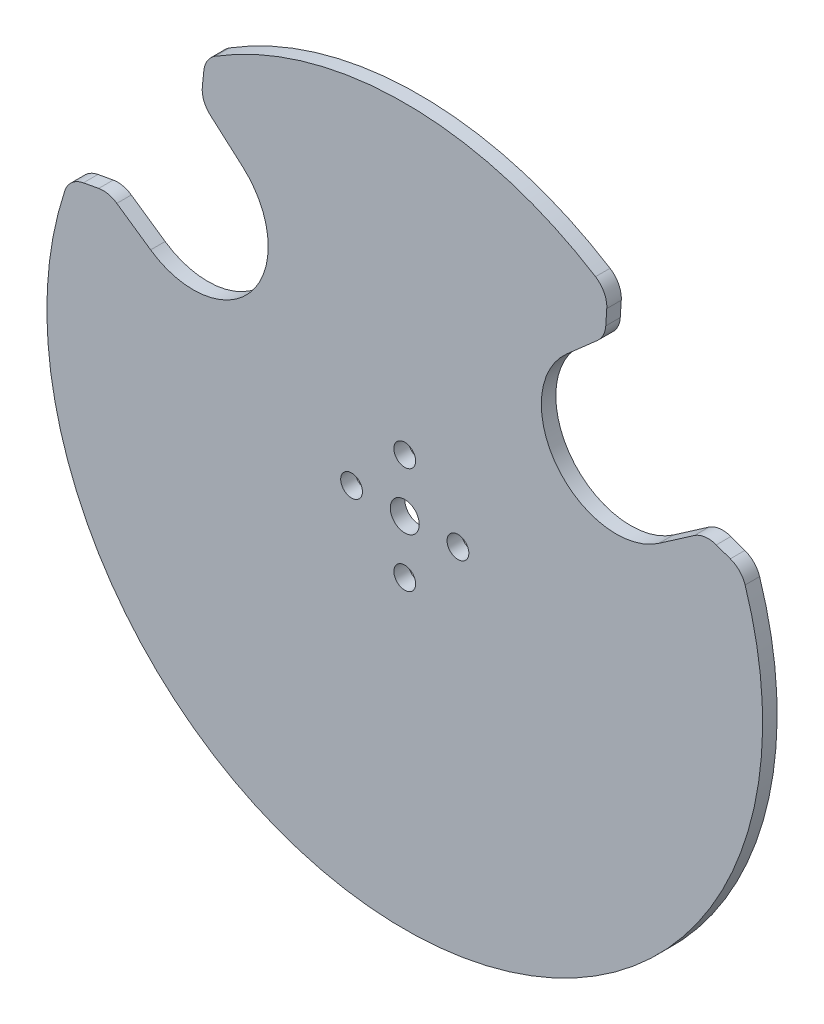
ISO-10303-21;
HEADER;
FILE_DESCRIPTION(('STEP AP214'),'2;1');
FILE_NAME('part.step','',(''),(''),'','','');
FILE_SCHEMA(('AUTOMOTIVE_DESIGN { 1 0 10303 214 1 1 1 1 }'));
ENDSEC;
DATA;
#1=APPLICATION_CONTEXT('core data for automotive mechanical design processes');
#2=APPLICATION_PROTOCOL_DEFINITION('international standard','automotive_design',2000,#1);
#3=PRODUCT_CONTEXT('',#1,'mechanical');
#4=PRODUCT('Part','Part','',(#3));
#5=PRODUCT_RELATED_PRODUCT_CATEGORY('part','',(#4));
#6=PRODUCT_DEFINITION_FORMATION('','',#4);
#7=PRODUCT_DEFINITION_CONTEXT('part definition',#1,'design');
#8=PRODUCT_DEFINITION('design','',#6,#7);
#9=PRODUCT_DEFINITION_SHAPE('','',#8);
#10=(LENGTH_UNIT() NAMED_UNIT(*) SI_UNIT(.MILLI.,.METRE.));
#11=(NAMED_UNIT(*) PLANE_ANGLE_UNIT() SI_UNIT($,.RADIAN.));
#12=(NAMED_UNIT(*) SI_UNIT($,.STERADIAN.) SOLID_ANGLE_UNIT());
#13=UNCERTAINTY_MEASURE_WITH_UNIT(LENGTH_MEASURE(1.E-05),#10,'distance_accuracy_value','');
#14=(GEOMETRIC_REPRESENTATION_CONTEXT(3) GLOBAL_UNCERTAINTY_ASSIGNED_CONTEXT((#13)) GLOBAL_UNIT_ASSIGNED_CONTEXT((#10,
#11,#12)) REPRESENTATION_CONTEXT('',''));
#15=CARTESIAN_POINT('',(0.,0.,0.));
#16=DIRECTION('',(0.,0.,1.));
#17=DIRECTION('',(1.,0.,0.));
#18=AXIS2_PLACEMENT_3D('',#15,#16,#17);
#19=CARTESIAN_POINT('',(0.,0.,3.));
#20=DIRECTION('',(0.,0.,1.));
#21=DIRECTION('',(1.,0.,0.));
#22=AXIS2_PLACEMENT_3D('',#19,#20,#21);
#23=PLANE('',#22);
#24=CARTESIAN_POINT('',(-11.,0.,3.));
#25=DIRECTION('',(0.,0.,1.));
#26=DIRECTION('',(1.,0.,0.));
#27=AXIS2_PLACEMENT_3D('',#24,#25,#26);
#28=CIRCLE('',#27,2.25);
#29=CARTESIAN_POINT('',(-8.75,0.,3.));
#30=VERTEX_POINT('',#29);
#31=EDGE_CURVE('E473',#30,#30,#28,.T.);
#32=ORIENTED_EDGE('',*,*,#31,.F.);
#33=EDGE_LOOP('',(#32));
#34=FACE_BOUND('',#33,.T.);
#35=CARTESIAN_POINT('',(11.,0.,3.));
#36=DIRECTION('',(0.,0.,1.));
#37=DIRECTION('',(1.,0.,0.));
#38=AXIS2_PLACEMENT_3D('',#35,#36,#37);
#39=CIRCLE('',#38,2.25);
#40=CARTESIAN_POINT('',(13.25,0.,3.));
#41=VERTEX_POINT('',#40);
#42=EDGE_CURVE('E457',#41,#41,#39,.T.);
#43=ORIENTED_EDGE('',*,*,#42,.F.);
#44=EDGE_LOOP('',(#43));
#45=FACE_BOUND('',#44,.T.);
#46=CARTESIAN_POINT('',(0.,0.,3.));
#47=DIRECTION('',(0.,0.,1.));
#48=DIRECTION('',(1.,0.,0.));
#49=AXIS2_PLACEMENT_3D('',#46,#47,#48);
#50=CIRCLE('',#49,74.);
#51=CARTESIAN_POINT('',(39.4431417206004,62.6118085604355,3.));
#52=VERTEX_POINT('',#51);
#53=CARTESIAN_POINT('',(-39.2208901456096,62.7512691201224,3.));
#54=VERTEX_POINT('',#53);
#55=EDGE_CURVE('E216',#52,#54,#50,.T.);
#56=ORIENTED_EDGE('',*,*,#55,.T.);
#57=CARTESIAN_POINT('',(-36.570830000636,58.5113185038979,3.));
#58=DIRECTION('',(0.,0.,1.));
#59=DIRECTION('',(1.,0.,0.));
#60=AXIS2_PLACEMENT_3D('',#57,#58,#59);
#61=CIRCLE('',#60,5.);
#62=CARTESIAN_POINT('',(-41.5444900097638,59.023867149007,3.));
#63=VERTEX_POINT('',#62);
#64=EDGE_CURVE('E326',#54,#63,#61,.T.);
#65=ORIENTED_EDGE('',*,*,#64,.T.);
#66=DIRECTION('',(0.102509729021823,0.994732001825553,0.));
#67=VECTOR('',#66,1.);
#68=CARTESIAN_POINT('',(-47.126576844926,4.85651674343806,3.));
#69=LINE('',#68,#67);
#70=CARTESIAN_POINT('',(-41.8599410967015,55.9627987588948,3.));
#71=VERTEX_POINT('',#70);
#72=EDGE_CURVE('E287',#63,#71,#69,.F.);
#73=ORIENTED_EDGE('',*,*,#72,.T.);
#74=CARTESIAN_POINT('',(-36.8862810875738,55.4502501137857,3.));
#75=DIRECTION('',(0.,0.,1.));
#76=DIRECTION('',(1.,0.,0.));
#77=AXIS2_PLACEMENT_3D('',#74,#75,#76);
#78=CIRCLE('',#77,5.);
#79=CARTESIAN_POINT('',(-40.1894843136318,51.6967386315386,3.));
#80=VERTEX_POINT('',#79);
#81=EDGE_CURVE('E323',#71,#80,#78,.T.);
#82=ORIENTED_EDGE('',*,*,#81,.T.);
#83=DIRECTION('',(0.750702296449405,-0.660640645211593,0.));
#84=VECTOR('',#83,1.);
#85=CARTESIAN_POINT('',(-46.6863350374643,57.4141630677451,3.));
#86=LINE('',#85,#84);
#87=CARTESIAN_POINT('',(-33.4946668243935,45.8050974755397,3.));
#88=VERTEX_POINT('',#87);
#89=EDGE_CURVE('E222',#80,#88,#86,.T.);
#90=ORIENTED_EDGE('',*,*,#89,.T.);
#91=CARTESIAN_POINT('',(-43.7345968251731,34.169211880574,3.));
#92=DIRECTION('',(0.,0.,-1.));
#93=DIRECTION('',(1.,0.,0.));
#94=AXIS2_PLACEMENT_3D('',#91,#92,#93);
#95=CIRCLE('',#94,15.5);
#96=CARTESIAN_POINT('',(-52.5475836128083,21.418476063337,3.));
#97=VERTEX_POINT('',#96);
#98=EDGE_CURVE('E225',#88,#97,#95,.T.);
#99=ORIENTED_EDGE('',*,*,#98,.T.);
#100=DIRECTION('',(-0.822628117241092,0.568579792750654,0.));
#101=VECTOR('',#100,1.);
#102=CARTESIAN_POINT('',(-67.003163723211,31.4098081987233,3.));
#103=LINE('',#102,#101);
#104=CARTESIAN_POINT('',(-59.5410482877698,26.2521823422256,3.));
#105=VERTEX_POINT('',#104);
#106=EDGE_CURVE('E228',#97,#105,#103,.T.);
#107=ORIENTED_EDGE('',*,*,#106,.T.);
#108=CARTESIAN_POINT('',(-62.383947251523,22.1390417560202,3.));
#109=DIRECTION('',(0.,0.,1.));
#110=DIRECTION('',(1.,0.,0.));
#111=AXIS2_PLACEMENT_3D('',#108,#109,#110);
#112=CIRCLE('',#111,5.);
#113=CARTESIAN_POINT('',(-63.2821437165044,27.0577044919978,3.));
#114=VERTEX_POINT('',#113);
#115=EDGE_CURVE('E317',#105,#114,#112,.T.);
#116=ORIENTED_EDGE('',*,*,#115,.T.);
#117=DIRECTION('',(0.983732547195528,0.179639292996267,0.));
#118=VECTOR('',#117,1.);
#119=CARTESIAN_POINT('',(-6.82368910381006,37.3675767222092,3.));
#120=LINE('',#119,#118);
#121=CARTESIAN_POINT('',(-66.4427229691683,26.4805514598797,3.));
#122=VERTEX_POINT('',#121);
#123=EDGE_CURVE('E283',#114,#122,#120,.F.);
#124=ORIENTED_EDGE('',*,*,#123,.T.);
#125=CARTESIAN_POINT('',(-65.544526504187,21.561888723902,3.));
#126=DIRECTION('',(0.,0.,1.));
#127=DIRECTION('',(1.,0.,0.));
#128=AXIS2_PLACEMENT_3D('',#125,#126,#127);
#129=CIRCLE('',#128,5.);
#130=CARTESIAN_POINT('',(-70.2941298740556,23.1243444285326,3.));
#131=VERTEX_POINT('',#130);
#132=EDGE_CURVE('E320',#122,#131,#129,.T.);
#133=ORIENTED_EDGE('',*,*,#132,.T.);
#134=CARTESIAN_POINT('',(0.,0.,3.));
#135=DIRECTION('',(0.,0.,1.));
#136=DIRECTION('',(1.,0.,0.));
#137=AXIS2_PLACEMENT_3D('',#134,#135,#136);
#138=CIRCLE('',#137,74.);
#139=CARTESIAN_POINT('',(70.375680336782,22.8749561122001,3.));
#140=VERTEX_POINT('',#139);
#141=EDGE_CURVE('E196',#131,#140,#138,.T.);
#142=ORIENTED_EDGE('',*,*,#141,.T.);
#143=CARTESIAN_POINT('',(65.6205668005129,21.3293509694839,3.));
#144=DIRECTION('',(0.,0.,1.));
#145=DIRECTION('',(1.,0.,0.));
#146=AXIS2_PLACEMENT_3D('',#143,#144,#145);
#147=CIRCLE('',#146,5.);
#148=CARTESIAN_POINT('',(67.3211278178473,26.0312752804786,3.));
#149=VERTEX_POINT('',#148);
#150=EDGE_CURVE('E314',#140,#149,#147,.T.);
#151=ORIENTED_EDGE('',*,*,#150,.T.);
#152=DIRECTION('',(0.940384862198932,-0.340112203466878,0.));
#153=VECTOR('',#152,1.);
#154=CARTESIAN_POINT('',(16.1132082441938,44.5518183700648,3.));
#155=LINE('',#154,#153);
#156=CARTESIAN_POINT('',(64.4273007660039,27.0778955894796,3.));
#157=VERTEX_POINT('',#156);
#158=EDGE_CURVE('E295',#149,#157,#155,.F.);
#159=ORIENTED_EDGE('',*,*,#158,.T.);
#160=CARTESIAN_POINT('',(62.7267397486695,22.3759712784849,3.));
#161=DIRECTION('',(0.,0.,1.));
#162=DIRECTION('',(1.,0.,0.));
#163=AXIS2_PLACEMENT_3D('',#160,#161,#162);
#164=CIRCLE('',#163,5.);
#165=CARTESIAN_POINT('',(59.8838407849162,26.4891118646904,3.));
#166=VERTEX_POINT('',#165);
#167=EDGE_CURVE('E191',#157,#166,#164,.T.);
#168=ORIENTED_EDGE('',*,*,#167,.T.);
#169=DIRECTION('',(-0.822628117241092,-0.568579792750654,0.));
#170=VECTOR('',#169,1.);
#171=CARTESIAN_POINT('',(67.003163723211,31.4098081987233,3.));
#172=LINE('',#171,#170);
#173=CARTESIAN_POINT('',(52.5475836128083,21.418476063337,3.));
#174=VERTEX_POINT('',#173);
#175=EDGE_CURVE('E181',#166,#174,#172,.T.);
#176=ORIENTED_EDGE('',*,*,#175,.T.);
#177=CARTESIAN_POINT('',(43.7345968251731,34.169211880574,3.));
#178=DIRECTION('',(0.,0.,-1.));
#179=DIRECTION('',(-1.,0.,0.));
#180=AXIS2_PLACEMENT_3D('',#177,#178,#179);
#181=CIRCLE('',#180,15.5);
#182=CARTESIAN_POINT('',(33.4946668243934,45.8050974755397,3.));
#183=VERTEX_POINT('',#182);
#184=EDGE_CURVE('E187',#174,#183,#181,.T.);
#185=ORIENTED_EDGE('',*,*,#184,.T.);
#186=DIRECTION('',(0.750702296449405,0.660640645211593,0.));
#187=VECTOR('',#186,1.);
#188=CARTESIAN_POINT('',(46.6863350374643,57.4141630677451,3.));
#189=LINE('',#188,#187);
#190=CARTESIAN_POINT('',(39.8766635998486,51.4214469757562,3.));
#191=VERTEX_POINT('',#190);
#192=EDGE_CURVE('E213',#183,#191,#189,.T.);
#193=ORIENTED_EDGE('',*,*,#192,.T.);
#194=CARTESIAN_POINT('',(36.5734603737906,55.1749584580032,3.));
#195=DIRECTION('',(0.,0.,1.));
#196=DIRECTION('',(1.,0.,0.));
#197=AXIS2_PLACEMENT_3D('',#194,#195,#196);
#198=CIRCLE('',#197,5.);
#199=CARTESIAN_POINT('',(41.5633111969319,54.8565424364276,3.));
#200=VERTEX_POINT('',#199);
#201=EDGE_CURVE('E306',#191,#200,#198,.T.);
#202=ORIENTED_EDGE('',*,*,#201,.T.);
#203=DIRECTION('',(-0.0636832043151176,-0.997970164628261,0.));
#204=VECTOR('',#203,1.);
#205=CARTESIAN_POINT('',(37.9083997978265,-2.4190386197401,3.));
#206=LINE('',#205,#204);
#207=CARTESIAN_POINT('',(41.7679154004579,58.0628649334251,3.));
#208=VERTEX_POINT('',#207);
#209=EDGE_CURVE('E291',#200,#208,#206,.F.);
#210=ORIENTED_EDGE('',*,*,#209,.T.);
#211=CARTESIAN_POINT('',(36.7780645773166,58.3812809550007,3.));
#212=DIRECTION('',(0.,0.,1.));
#213=DIRECTION('',(1.,0.,0.));
#214=AXIS2_PLACEMENT_3D('',#211,#212,#213);
#215=CIRCLE('',#214,5.);
#216=EDGE_CURVE('E309',#208,#52,#215,.T.);
#217=ORIENTED_EDGE('',*,*,#216,.T.);
#218=EDGE_LOOP('',(#56,#65,#73,#82,#90,#99,#107,#116,#124,#133,#142,#151,#159,#168,#176,#185,
#193,#202,#210,#217));
#219=FACE_BOUND('',#218,.T.);
#220=CARTESIAN_POINT('',(0.,11.,3.));
#221=DIRECTION('',(0.,0.,1.));
#222=DIRECTION('',(1.,0.,0.));
#223=AXIS2_PLACEMENT_3D('',#220,#221,#222);
#224=CIRCLE('',#223,2.25);
#225=CARTESIAN_POINT('',(2.25,11.,3.));
#226=VERTEX_POINT('',#225);
#227=EDGE_CURVE('E237',#226,#226,#224,.T.);
#228=ORIENTED_EDGE('',*,*,#227,.F.);
#229=EDGE_LOOP('',(#228));
#230=FACE_BOUND('',#229,.T.);
#231=CARTESIAN_POINT('',(0.,-11.,3.));
#232=DIRECTION('',(0.,0.,1.));
#233=DIRECTION('',(1.,0.,0.));
#234=AXIS2_PLACEMENT_3D('',#231,#232,#233);
#235=CIRCLE('',#234,2.25);
#236=CARTESIAN_POINT('',(2.25,-11.,3.));
#237=VERTEX_POINT('',#236);
#238=EDGE_CURVE('E465',#237,#237,#235,.T.);
#239=ORIENTED_EDGE('',*,*,#238,.F.);
#240=EDGE_LOOP('',(#239));
#241=FACE_BOUND('',#240,.T.);
#242=CARTESIAN_POINT('',(0.,0.,3.));
#243=DIRECTION('',(0.,0.,1.));
#244=DIRECTION('',(1.,0.,0.));
#245=AXIS2_PLACEMENT_3D('',#242,#243,#244);
#246=CIRCLE('',#245,3.);
#247=CARTESIAN_POINT('',(3.,0.,3.));
#248=VERTEX_POINT('',#247);
#249=EDGE_CURVE('E481',#248,#248,#246,.T.);
#250=ORIENTED_EDGE('',*,*,#249,.F.);
#251=EDGE_LOOP('',(#250));
#252=FACE_BOUND('',#251,.T.);
#253=ADVANCED_FACE('F41',(#34,#45,#219,#230,#241,#252),#23,.T.);
#254=CARTESIAN_POINT('',(0.,0.,0.));
#255=DIRECTION('',(0.,0.,1.));
#256=DIRECTION('',(1.,0.,0.));
#257=AXIS2_PLACEMENT_3D('',#254,#255,#256);
#258=PLANE('',#257);
#259=DIRECTION('',(-0.102509729021823,-0.994732001825553,0.));
#260=VECTOR('',#259,1.);
#261=CARTESIAN_POINT('',(-42.1241188746954,53.3992753504414,0.));
#262=LINE('',#261,#260);
#263=CARTESIAN_POINT('',(-41.8599410967016,55.9627987588948,0.));
#264=VERTEX_POINT('',#263);
#265=CARTESIAN_POINT('',(-41.5444900097638,59.023867149007,0.));
#266=VERTEX_POINT('',#265);
#267=EDGE_CURVE('E272',#264,#266,#262,.F.);
#268=ORIENTED_EDGE('',*,*,#267,.T.);
#269=CARTESIAN_POINT('',(-36.570830000636,58.5113185038979,0.));
#270=DIRECTION('',(0.,0.,1.));
#271=DIRECTION('',(1.,0.,0.));
#272=AXIS2_PLACEMENT_3D('',#269,#270,#271);
#273=CIRCLE('',#272,5.);
#274=CARTESIAN_POINT('',(-39.2208901456096,62.7512691201224,0.));
#275=VERTEX_POINT('',#274);
#276=EDGE_CURVE('E355',#266,#275,#273,.F.);
#277=ORIENTED_EDGE('',*,*,#276,.T.);
#278=CARTESIAN_POINT('',(0.,0.,0.));
#279=DIRECTION('',(0.,0.,1.));
#280=DIRECTION('',(1.,0.,0.));
#281=AXIS2_PLACEMENT_3D('',#278,#279,#280);
#282=CIRCLE('',#281,74.);
#283=CARTESIAN_POINT('',(39.4431417206004,62.6118085604355,0.));
#284=VERTEX_POINT('',#283);
#285=EDGE_CURVE('E246',#284,#275,#282,.T.);
#286=ORIENTED_EDGE('',*,*,#285,.F.);
#287=CARTESIAN_POINT('',(36.7780645773166,58.3812809550007,0.));
#288=DIRECTION('',(0.,0.,1.));
#289=DIRECTION('',(1.,0.,0.));
#290=AXIS2_PLACEMENT_3D('',#287,#288,#289);
#291=CIRCLE('',#290,5.);
#292=CARTESIAN_POINT('',(41.7679154004579,58.0628649334251,0.));
#293=VERTEX_POINT('',#292);
#294=EDGE_CURVE('E337',#284,#293,#291,.F.);
#295=ORIENTED_EDGE('',*,*,#294,.T.);
#296=DIRECTION('',(0.0636832043151176,0.997970164628261,0.));
#297=VECTOR('',#296,1.);
#298=CARTESIAN_POINT('',(41.9527102160618,60.9587574145597,0.));
#299=LINE('',#298,#297);
#300=CARTESIAN_POINT('',(41.5633111969319,54.8565424364276,0.));
#301=VERTEX_POINT('',#300);
#302=EDGE_CURVE('E276',#293,#301,#299,.F.);
#303=ORIENTED_EDGE('',*,*,#302,.T.);
#304=CARTESIAN_POINT('',(36.5734603737906,55.1749584580032,0.));
#305=DIRECTION('',(0.,0.,1.));
#306=DIRECTION('',(1.,0.,0.));
#307=AXIS2_PLACEMENT_3D('',#304,#305,#306);
#308=CIRCLE('',#307,5.);
#309=CARTESIAN_POINT('',(39.8766635998486,51.4214469757562,0.));
#310=VERTEX_POINT('',#309);
#311=EDGE_CURVE('E57',#301,#310,#308,.F.);
#312=ORIENTED_EDGE('',*,*,#311,.T.);
#313=DIRECTION('',(0.750702296449405,0.660640645211593,0.));
#314=VECTOR('',#313,1.);
#315=CARTESIAN_POINT('',(46.6863350374643,57.4141630677451,0.));
#316=LINE('',#315,#314);
#317=CARTESIAN_POINT('',(33.4946668243934,45.8050974755397,0.));
#318=VERTEX_POINT('',#317);
#319=EDGE_CURVE('E243',#318,#310,#316,.T.);
#320=ORIENTED_EDGE('',*,*,#319,.F.);
#321=CARTESIAN_POINT('',(43.7345968251731,34.169211880574,0.));
#322=DIRECTION('',(0.,0.,-1.));
#323=DIRECTION('',(-1.,0.,0.));
#324=AXIS2_PLACEMENT_3D('',#321,#322,#323);
#325=CIRCLE('',#324,15.5);
#326=CARTESIAN_POINT('',(52.5475836128083,21.418476063337,0.));
#327=VERTEX_POINT('',#326);
#328=EDGE_CURVE('E240',#327,#318,#325,.T.);
#329=ORIENTED_EDGE('',*,*,#328,.F.);
#330=DIRECTION('',(-0.822628117241092,-0.568579792750654,0.));
#331=VECTOR('',#330,1.);
#332=CARTESIAN_POINT('',(67.003163723211,31.4098081987233,0.));
#333=LINE('',#332,#331);
#334=CARTESIAN_POINT('',(59.8838407849162,26.4891118646904,0.));
#335=VERTEX_POINT('',#334);
#336=EDGE_CURVE('E202',#335,#327,#333,.T.);
#337=ORIENTED_EDGE('',*,*,#336,.F.);
#338=CARTESIAN_POINT('',(62.7267397486695,22.3759712784849,0.));
#339=DIRECTION('',(0.,0.,1.));
#340=DIRECTION('',(1.,0.,0.));
#341=AXIS2_PLACEMENT_3D('',#338,#339,#340);
#342=CIRCLE('',#341,5.);
#343=CARTESIAN_POINT('',(64.4273007660039,27.0778955894796,0.));
#344=VERTEX_POINT('',#343);
#345=EDGE_CURVE('E340',#335,#344,#342,.F.);
#346=ORIENTED_EDGE('',*,*,#345,.T.);
#347=DIRECTION('',(-0.940384862198932,0.340112203466878,0.));
#348=VECTOR('',#347,1.);
#349=CARTESIAN_POINT('',(62.0038353474007,27.9543986008313,0.));
#350=LINE('',#349,#348);
#351=CARTESIAN_POINT('',(67.3211278178473,26.0312752804786,0.));
#352=VERTEX_POINT('',#351);
#353=EDGE_CURVE('E279',#344,#352,#350,.F.);
#354=ORIENTED_EDGE('',*,*,#353,.T.);
#355=CARTESIAN_POINT('',(65.6205668005129,21.3293509694839,0.));
#356=DIRECTION('',(0.,0.,1.));
#357=DIRECTION('',(1.,0.,0.));
#358=AXIS2_PLACEMENT_3D('',#355,#356,#357);
#359=CIRCLE('',#358,5.);
#360=CARTESIAN_POINT('',(70.375680336782,22.8749561122001,0.));
#361=VERTEX_POINT('',#360);
#362=EDGE_CURVE('E343',#352,#361,#359,.F.);
#363=ORIENTED_EDGE('',*,*,#362,.T.);
#364=CARTESIAN_POINT('',(0.,0.,0.));
#365=DIRECTION('',(0.,0.,1.));
#366=DIRECTION('',(1.,0.,0.));
#367=AXIS2_PLACEMENT_3D('',#364,#365,#366);
#368=CIRCLE('',#367,74.);
#369=CARTESIAN_POINT('',(-70.2941298740556,23.1243444285326,0.));
#370=VERTEX_POINT('',#369);
#371=EDGE_CURVE('E233',#370,#361,#368,.T.);
#372=ORIENTED_EDGE('',*,*,#371,.F.);
#373=CARTESIAN_POINT('',(-65.544526504187,21.561888723902,0.));
#374=DIRECTION('',(0.,0.,1.));
#375=DIRECTION('',(1.,0.,0.));
#376=AXIS2_PLACEMENT_3D('',#373,#374,#375);
#377=CIRCLE('',#376,5.);
#378=CARTESIAN_POINT('',(-66.4427229691683,26.4805514598797,0.));
#379=VERTEX_POINT('',#378);
#380=EDGE_CURVE('E349',#370,#379,#377,.F.);
#381=ORIENTED_EDGE('',*,*,#380,.T.);
#382=DIRECTION('',(-0.983732547195528,-0.179639292996267,0.));
#383=VECTOR('',#382,1.);
#384=CARTESIAN_POINT('',(-69.2973009794559,25.9592772812092,0.));
#385=LINE('',#384,#383);
#386=CARTESIAN_POINT('',(-63.2821437165044,27.0577044919978,0.));
#387=VERTEX_POINT('',#386);
#388=EDGE_CURVE('E206',#379,#387,#385,.F.);
#389=ORIENTED_EDGE('',*,*,#388,.T.);
#390=CARTESIAN_POINT('',(-62.383947251523,22.1390417560202,0.));
#391=DIRECTION('',(0.,0.,1.));
#392=DIRECTION('',(1.,0.,0.));
#393=AXIS2_PLACEMENT_3D('',#390,#391,#392);
#394=CIRCLE('',#393,5.);
#395=CARTESIAN_POINT('',(-59.5410482877698,26.2521823422256,0.));
#396=VERTEX_POINT('',#395);
#397=EDGE_CURVE('E346',#387,#396,#394,.F.);
#398=ORIENTED_EDGE('',*,*,#397,.T.);
#399=DIRECTION('',(-0.822628117241092,0.568579792750654,0.));
#400=VECTOR('',#399,1.);
#401=CARTESIAN_POINT('',(-67.003163723211,31.4098081987233,0.));
#402=LINE('',#401,#400);
#403=CARTESIAN_POINT('',(-52.5475836128083,21.418476063337,0.));
#404=VERTEX_POINT('',#403);
#405=EDGE_CURVE('E256',#404,#396,#402,.T.);
#406=ORIENTED_EDGE('',*,*,#405,.F.);
#407=CARTESIAN_POINT('',(-43.7345968251731,34.169211880574,0.));
#408=DIRECTION('',(0.,0.,-1.));
#409=DIRECTION('',(1.,0.,0.));
#410=AXIS2_PLACEMENT_3D('',#407,#408,#409);
#411=CIRCLE('',#410,15.5);
#412=CARTESIAN_POINT('',(-33.4946668243935,45.8050974755397,0.));
#413=VERTEX_POINT('',#412);
#414=EDGE_CURVE('E253',#413,#404,#411,.T.);
#415=ORIENTED_EDGE('',*,*,#414,.F.);
#416=DIRECTION('',(0.750702296449405,-0.660640645211593,0.));
#417=VECTOR('',#416,1.);
#418=CARTESIAN_POINT('',(-46.6863350374643,57.4141630677451,0.));
#419=LINE('',#418,#417);
#420=CARTESIAN_POINT('',(-40.1894843136318,51.6967386315386,0.));
#421=VERTEX_POINT('',#420);
#422=EDGE_CURVE('E250',#421,#413,#419,.T.);
#423=ORIENTED_EDGE('',*,*,#422,.F.);
#424=CARTESIAN_POINT('',(-36.8862810875738,55.4502501137857,0.));
#425=DIRECTION('',(0.,0.,1.));
#426=DIRECTION('',(1.,0.,0.));
#427=AXIS2_PLACEMENT_3D('',#424,#425,#426);
#428=CIRCLE('',#427,5.);
#429=EDGE_CURVE('E352',#421,#264,#428,.F.);
#430=ORIENTED_EDGE('',*,*,#429,.T.);
#431=EDGE_LOOP('',(#268,#277,#286,#295,#303,#312,#320,#329,#337,#346,#354,#363,#372,#381,#389,
#398,#406,#415,#423,#430));
#432=FACE_BOUND('',#431,.T.);
#433=CARTESIAN_POINT('',(0.,11.,0.));
#434=DIRECTION('',(0.,0.,1.));
#435=DIRECTION('',(1.,0.,0.));
#436=AXIS2_PLACEMENT_3D('',#433,#434,#435);
#437=CIRCLE('',#436,2.25);
#438=CARTESIAN_POINT('',(2.25,11.,0.));
#439=VERTEX_POINT('',#438);
#440=EDGE_CURVE('E453',#439,#439,#437,.T.);
#441=ORIENTED_EDGE('',*,*,#440,.T.);
#442=EDGE_LOOP('',(#441));
#443=FACE_BOUND('',#442,.T.);
#444=CARTESIAN_POINT('',(11.,0.,0.));
#445=DIRECTION('',(0.,0.,1.));
#446=DIRECTION('',(1.,0.,0.));
#447=AXIS2_PLACEMENT_3D('',#444,#445,#446);
#448=CIRCLE('',#447,2.25);
#449=CARTESIAN_POINT('',(13.25,0.,0.));
#450=VERTEX_POINT('',#449);
#451=EDGE_CURVE('E461',#450,#450,#448,.T.);
#452=ORIENTED_EDGE('',*,*,#451,.T.);
#453=EDGE_LOOP('',(#452));
#454=FACE_BOUND('',#453,.T.);
#455=CARTESIAN_POINT('',(0.,-11.,0.));
#456=DIRECTION('',(0.,0.,1.));
#457=DIRECTION('',(1.,0.,0.));
#458=AXIS2_PLACEMENT_3D('',#455,#456,#457);
#459=CIRCLE('',#458,2.25);
#460=CARTESIAN_POINT('',(2.25,-11.,0.));
#461=VERTEX_POINT('',#460);
#462=EDGE_CURVE('E469',#461,#461,#459,.T.);
#463=ORIENTED_EDGE('',*,*,#462,.T.);
#464=EDGE_LOOP('',(#463));
#465=FACE_BOUND('',#464,.T.);
#466=CARTESIAN_POINT('',(-11.,0.,0.));
#467=DIRECTION('',(0.,0.,1.));
#468=DIRECTION('',(1.,0.,0.));
#469=AXIS2_PLACEMENT_3D('',#466,#467,#468);
#470=CIRCLE('',#469,2.25);
#471=CARTESIAN_POINT('',(-8.75,0.,0.));
#472=VERTEX_POINT('',#471);
#473=EDGE_CURVE('E477',#472,#472,#470,.T.);
#474=ORIENTED_EDGE('',*,*,#473,.T.);
#475=EDGE_LOOP('',(#474));
#476=FACE_BOUND('',#475,.T.);
#477=CARTESIAN_POINT('',(0.,0.,0.));
#478=DIRECTION('',(0.,0.,1.));
#479=DIRECTION('',(1.,0.,0.));
#480=AXIS2_PLACEMENT_3D('',#477,#478,#479);
#481=CIRCLE('',#480,3.);
#482=CARTESIAN_POINT('',(3.,0.,0.));
#483=VERTEX_POINT('',#482);
#484=EDGE_CURVE('E485',#483,#483,#481,.T.);
#485=ORIENTED_EDGE('',*,*,#484,.T.);
#486=EDGE_LOOP('',(#485));
#487=FACE_BOUND('',#486,.T.);
#488=ADVANCED_FACE('F402',(#432,#443,#454,#465,#476,#487),#258,.F.);
#489=CARTESIAN_POINT('',(0.,0.,3.));
#490=DIRECTION('',(0.,0.,-1.));
#491=DIRECTION('',(-1.,0.,0.));
#492=AXIS2_PLACEMENT_3D('',#489,#490,#491);
#493=CYLINDRICAL_SURFACE('',#492,74.);
#494=ORIENTED_EDGE('',*,*,#141,.F.);
#495=DIRECTION('',(0.,0.,-1.));
#496=VECTOR('',#495,1.);
#497=CARTESIAN_POINT('',(-70.2941298740556,23.1243444285326,3.));
#498=LINE('',#497,#496);
#499=EDGE_CURVE('E366',#131,#370,#498,.T.);
#500=ORIENTED_EDGE('',*,*,#499,.T.);
#501=ORIENTED_EDGE('',*,*,#371,.T.);
#502=DIRECTION('',(0.,0.,-1.));
#503=VECTOR('',#502,1.);
#504=CARTESIAN_POINT('',(70.375680336782,22.8749561122002,3.));
#505=LINE('',#504,#503);
#506=EDGE_CURVE('E362',#361,#140,#505,.F.);
#507=ORIENTED_EDGE('',*,*,#506,.T.);
#508=EDGE_LOOP('',(#494,#500,#501,#507));
#509=FACE_BOUND('',#508,.T.);
#510=ADVANCED_FACE('F448',(#509),#493,.T.);
#511=CARTESIAN_POINT('',(67.003163723211,31.4098081987233,3.));
#512=DIRECTION('',(0.568579792750654,-0.822628117241092,0.));
#513=DIRECTION('',(0.822628117241092,0.568579792750654,0.));
#514=AXIS2_PLACEMENT_3D('',#511,#512,#513);
#515=PLANE('',#514);
#516=ORIENTED_EDGE('',*,*,#175,.F.);
#517=DIRECTION('',(0.,0.,1.));
#518=VECTOR('',#517,1.);
#519=CARTESIAN_POINT('',(59.8838407849162,26.4891118646904,0.));
#520=LINE('',#519,#518);
#521=EDGE_CURVE('E386',#166,#335,#520,.F.);
#522=ORIENTED_EDGE('',*,*,#521,.T.);
#523=ORIENTED_EDGE('',*,*,#336,.T.);
#524=DIRECTION('',(0.,0.,-1.));
#525=VECTOR('',#524,1.);
#526=CARTESIAN_POINT('',(52.5475836128083,21.418476063337,3.));
#527=LINE('',#526,#525);
#528=EDGE_CURVE('E199',#174,#327,#527,.T.);
#529=ORIENTED_EDGE('',*,*,#528,.F.);
#530=EDGE_LOOP('',(#516,#522,#523,#529));
#531=FACE_BOUND('',#530,.T.);
#532=ADVANCED_FACE('F200',(#531),#515,.F.);
#533=CARTESIAN_POINT('',(43.7345968251731,34.169211880574,3.));
#534=DIRECTION('',(0.,0.,-1.));
#535=DIRECTION('',(-1.,0.,0.));
#536=AXIS2_PLACEMENT_3D('',#533,#534,#535);
#537=CYLINDRICAL_SURFACE('',#536,15.5);
#538=ORIENTED_EDGE('',*,*,#328,.T.);
#539=DIRECTION('',(0.,0.,-1.));
#540=VECTOR('',#539,1.);
#541=CARTESIAN_POINT('',(33.4946668243934,45.8050974755397,3.));
#542=LINE('',#541,#540);
#543=EDGE_CURVE('E207',#183,#318,#542,.T.);
#544=ORIENTED_EDGE('',*,*,#543,.F.);
#545=ORIENTED_EDGE('',*,*,#184,.F.);
#546=ORIENTED_EDGE('',*,*,#528,.T.);
#547=EDGE_LOOP('',(#538,#544,#545,#546));
#548=FACE_BOUND('',#547,.T.);
#549=ADVANCED_FACE('F209',(#548),#537,.F.);
#550=CARTESIAN_POINT('',(46.6863350374643,57.4141630677451,3.));
#551=DIRECTION('',(-0.660640645211593,0.750702296449405,0.));
#552=DIRECTION('',(-0.750702296449405,-0.660640645211593,0.));
#553=AXIS2_PLACEMENT_3D('',#550,#551,#552);
#554=PLANE('',#553);
#555=ORIENTED_EDGE('',*,*,#319,.T.);
#556=DIRECTION('',(0.,0.,-1.));
#557=VECTOR('',#556,1.);
#558=CARTESIAN_POINT('',(39.8766635998486,51.4214469757562,3.));
#559=LINE('',#558,#557);
#560=EDGE_CURVE('E11',#310,#191,#559,.F.);
#561=ORIENTED_EDGE('',*,*,#560,.T.);
#562=ORIENTED_EDGE('',*,*,#192,.F.);
#563=ORIENTED_EDGE('',*,*,#543,.T.);
#564=EDGE_LOOP('',(#555,#561,#562,#563));
#565=FACE_BOUND('',#564,.T.);
#566=ADVANCED_FACE('F517',(#565),#554,.F.);
#567=CARTESIAN_POINT('',(0.,0.,3.));
#568=DIRECTION('',(0.,0.,-1.));
#569=DIRECTION('',(-1.,0.,0.));
#570=AXIS2_PLACEMENT_3D('',#567,#568,#569);
#571=CYLINDRICAL_SURFACE('',#570,74.);
#572=ORIENTED_EDGE('',*,*,#285,.T.);
#573=DIRECTION('',(0.,0.,-1.));
#574=VECTOR('',#573,1.);
#575=CARTESIAN_POINT('',(-39.2208901456096,62.7512691201224,3.));
#576=LINE('',#575,#574);
#577=EDGE_CURVE('E302',#275,#54,#576,.F.);
#578=ORIENTED_EDGE('',*,*,#577,.T.);
#579=ORIENTED_EDGE('',*,*,#55,.F.);
#580=DIRECTION('',(0.,0.,-1.));
#581=VECTOR('',#580,1.);
#582=CARTESIAN_POINT('',(39.4431417206004,62.6118085604355,3.));
#583=LINE('',#582,#581);
#584=EDGE_CURVE('E298',#52,#284,#583,.T.);
#585=ORIENTED_EDGE('',*,*,#584,.T.);
#586=EDGE_LOOP('',(#572,#578,#579,#585));
#587=FACE_BOUND('',#586,.T.);
#588=ADVANCED_FACE('F400',(#587),#571,.T.);
#589=CARTESIAN_POINT('',(-46.6863350374643,57.4141630677451,3.));
#590=DIRECTION('',(0.660640645211593,0.750702296449405,0.));
#591=DIRECTION('',(-0.750702296449405,0.660640645211593,0.));
#592=AXIS2_PLACEMENT_3D('',#589,#590,#591);
#593=PLANE('',#592);
#594=ORIENTED_EDGE('',*,*,#89,.F.);
#595=DIRECTION('',(0.,0.,1.));
#596=VECTOR('',#595,1.);
#597=CARTESIAN_POINT('',(-40.1894843136318,51.6967386315386,0.));
#598=LINE('',#597,#596);
#599=EDGE_CURVE('E358',#80,#421,#598,.F.);
#600=ORIENTED_EDGE('',*,*,#599,.T.);
#601=ORIENTED_EDGE('',*,*,#422,.T.);
#602=DIRECTION('',(0.,0.,-1.));
#603=VECTOR('',#602,1.);
#604=CARTESIAN_POINT('',(-33.4946668243935,45.8050974755397,3.));
#605=LINE('',#604,#603);
#606=EDGE_CURVE('E263',#88,#413,#605,.T.);
#607=ORIENTED_EDGE('',*,*,#606,.F.);
#608=EDGE_LOOP('',(#594,#600,#601,#607));
#609=FACE_BOUND('',#608,.T.);
#610=ADVANCED_FACE('F420',(#609),#593,.F.);
#611=CARTESIAN_POINT('',(-43.7345968251731,34.169211880574,3.));
#612=DIRECTION('',(0.,0.,-1.));
#613=DIRECTION('',(-1.,0.,0.));
#614=AXIS2_PLACEMENT_3D('',#611,#612,#613);
#615=CYLINDRICAL_SURFACE('',#614,15.5);
#616=ORIENTED_EDGE('',*,*,#414,.T.);
#617=DIRECTION('',(0.,0.,-1.));
#618=VECTOR('',#617,1.);
#619=CARTESIAN_POINT('',(-52.5475836128083,21.418476063337,3.));
#620=LINE('',#619,#618);
#621=EDGE_CURVE('E232',#97,#404,#620,.T.);
#622=ORIENTED_EDGE('',*,*,#621,.F.);
#623=ORIENTED_EDGE('',*,*,#98,.F.);
#624=ORIENTED_EDGE('',*,*,#606,.T.);
#625=EDGE_LOOP('',(#616,#622,#623,#624));
#626=FACE_BOUND('',#625,.T.);
#627=ADVANCED_FACE('F426',(#626),#615,.F.);
#628=CARTESIAN_POINT('',(-67.003163723211,31.4098081987233,3.));
#629=DIRECTION('',(-0.568579792750654,-0.822628117241092,0.));
#630=DIRECTION('',(0.822628117241092,-0.568579792750654,0.));
#631=AXIS2_PLACEMENT_3D('',#628,#629,#630);
#632=PLANE('',#631);
#633=ORIENTED_EDGE('',*,*,#405,.T.);
#634=DIRECTION('',(0.,0.,-1.));
#635=VECTOR('',#634,1.);
#636=CARTESIAN_POINT('',(-59.5410482877698,26.2521823422256,3.));
#637=LINE('',#636,#635);
#638=EDGE_CURVE('E376',#396,#105,#637,.F.);
#639=ORIENTED_EDGE('',*,*,#638,.T.);
#640=ORIENTED_EDGE('',*,*,#106,.F.);
#641=ORIENTED_EDGE('',*,*,#621,.T.);
#642=EDGE_LOOP('',(#633,#639,#640,#641));
#643=FACE_BOUND('',#642,.T.);
#644=ADVANCED_FACE('F430',(#643),#632,.F.);
#645=CARTESIAN_POINT('',(0.,11.,3.));
#646=DIRECTION('',(0.,0.,-1.));
#647=DIRECTION('',(-1.,0.,0.));
#648=AXIS2_PLACEMENT_3D('',#645,#646,#647);
#649=CYLINDRICAL_SURFACE('',#648,2.25);
#650=ORIENTED_EDGE('',*,*,#227,.T.);
#651=EDGE_LOOP('',(#650));
#652=FACE_BOUND('',#651,.T.);
#653=ORIENTED_EDGE('',*,*,#440,.F.);
#654=EDGE_LOOP('',(#653));
#655=FACE_BOUND('',#654,.T.);
#656=ADVANCED_FACE('F506',(#652,#655),#649,.F.);
#657=CARTESIAN_POINT('',(11.,0.,3.));
#658=DIRECTION('',(0.,0.,-1.));
#659=DIRECTION('',(-1.,0.,0.));
#660=AXIS2_PLACEMENT_3D('',#657,#658,#659);
#661=CYLINDRICAL_SURFACE('',#660,2.25);
#662=ORIENTED_EDGE('',*,*,#42,.T.);
#663=EDGE_LOOP('',(#662));
#664=FACE_BOUND('',#663,.T.);
#665=ORIENTED_EDGE('',*,*,#451,.F.);
#666=EDGE_LOOP('',(#665));
#667=FACE_BOUND('',#666,.T.);
#668=ADVANCED_FACE('F707',(#664,#667),#661,.F.);
#669=CARTESIAN_POINT('',(0.,-11.,3.));
#670=DIRECTION('',(0.,0.,-1.));
#671=DIRECTION('',(-1.,0.,0.));
#672=AXIS2_PLACEMENT_3D('',#669,#670,#671);
#673=CYLINDRICAL_SURFACE('',#672,2.25);
#674=ORIENTED_EDGE('',*,*,#238,.T.);
#675=EDGE_LOOP('',(#674));
#676=FACE_BOUND('',#675,.T.);
#677=ORIENTED_EDGE('',*,*,#462,.F.);
#678=EDGE_LOOP('',(#677));
#679=FACE_BOUND('',#678,.T.);
#680=ADVANCED_FACE('F697',(#676,#679),#673,.F.);
#681=CARTESIAN_POINT('',(-11.,0.,3.));
#682=DIRECTION('',(0.,0.,-1.));
#683=DIRECTION('',(-1.,0.,0.));
#684=AXIS2_PLACEMENT_3D('',#681,#682,#683);
#685=CYLINDRICAL_SURFACE('',#684,2.25);
#686=ORIENTED_EDGE('',*,*,#31,.T.);
#687=EDGE_LOOP('',(#686));
#688=FACE_BOUND('',#687,.T.);
#689=ORIENTED_EDGE('',*,*,#473,.F.);
#690=EDGE_LOOP('',(#689));
#691=FACE_BOUND('',#690,.T.);
#692=ADVANCED_FACE('F688',(#688,#691),#685,.F.);
#693=CARTESIAN_POINT('',(0.,0.,3.));
#694=DIRECTION('',(0.,0.,-1.));
#695=DIRECTION('',(-1.,0.,0.));
#696=AXIS2_PLACEMENT_3D('',#693,#694,#695);
#697=CYLINDRICAL_SURFACE('',#696,3.);
#698=ORIENTED_EDGE('',*,*,#249,.T.);
#699=EDGE_LOOP('',(#698));
#700=FACE_BOUND('',#699,.T.);
#701=ORIENTED_EDGE('',*,*,#484,.F.);
#702=EDGE_LOOP('',(#701));
#703=FACE_BOUND('',#702,.T.);
#704=ADVANCED_FACE('F493',(#700,#703),#697,.F.);
#705=CARTESIAN_POINT('',(62.0038353474007,27.9543986008313,3.));
#706=DIRECTION('',(-0.340112203466878,-0.940384862198932,0.));
#707=DIRECTION('',(0.,0.,-1.));
#708=AXIS2_PLACEMENT_3D('',#705,#706,#707);
#709=PLANE('',#708);
#710=ORIENTED_EDGE('',*,*,#158,.F.);
#711=DIRECTION('',(0.,0.,-1.));
#712=VECTOR('',#711,1.);
#713=CARTESIAN_POINT('',(67.3211278178473,26.0312752804786,0.));
#714=LINE('',#713,#712);
#715=EDGE_CURVE('E383',#149,#352,#714,.T.);
#716=ORIENTED_EDGE('',*,*,#715,.T.);
#717=ORIENTED_EDGE('',*,*,#353,.F.);
#718=DIRECTION('',(0.,0.,-1.));
#719=VECTOR('',#718,1.);
#720=CARTESIAN_POINT('',(64.4273007660039,27.0778955894796,3.));
#721=LINE('',#720,#719);
#722=EDGE_CURVE('E380',#344,#157,#721,.F.);
#723=ORIENTED_EDGE('',*,*,#722,.T.);
#724=EDGE_LOOP('',(#710,#716,#717,#723));
#725=FACE_BOUND('',#724,.T.);
#726=ADVANCED_FACE('F527',(#725),#709,.F.);
#727=CARTESIAN_POINT('',(41.9527102160618,60.9587574145597,3.));
#728=DIRECTION('',(-0.997970164628261,0.0636832043151176,0.));
#729=DIRECTION('',(0.,0.,-1.));
#730=AXIS2_PLACEMENT_3D('',#727,#728,#729);
#731=PLANE('',#730);
#732=ORIENTED_EDGE('',*,*,#302,.F.);
#733=DIRECTION('',(0.,0.,-1.));
#734=VECTOR('',#733,1.);
#735=CARTESIAN_POINT('',(41.7679154004579,58.0628649334251,3.));
#736=LINE('',#735,#734);
#737=EDGE_CURVE('E50',#293,#208,#736,.F.);
#738=ORIENTED_EDGE('',*,*,#737,.T.);
#739=ORIENTED_EDGE('',*,*,#209,.F.);
#740=DIRECTION('',(0.,0.,1.));
#741=VECTOR('',#740,1.);
#742=CARTESIAN_POINT('',(41.5633111969319,54.8565424364276,0.));
#743=LINE('',#742,#741);
#744=EDGE_CURVE('E65',#200,#301,#743,.F.);
#745=ORIENTED_EDGE('',*,*,#744,.T.);
#746=EDGE_LOOP('',(#732,#738,#739,#745));
#747=FACE_BOUND('',#746,.T.);
#748=ADVANCED_FACE('F392',(#747),#731,.F.);
#749=CARTESIAN_POINT('',(-42.1241188746954,53.3992753504414,3.));
#750=DIRECTION('',(0.994732001825553,-0.102509729021823,0.));
#751=DIRECTION('',(0.,0.,-1.));
#752=AXIS2_PLACEMENT_3D('',#749,#750,#751);
#753=PLANE('',#752);
#754=ORIENTED_EDGE('',*,*,#72,.F.);
#755=DIRECTION('',(0.,0.,-1.));
#756=VECTOR('',#755,1.);
#757=CARTESIAN_POINT('',(-41.5444900097638,59.023867149007,0.));
#758=LINE('',#757,#756);
#759=EDGE_CURVE('E332',#63,#266,#758,.T.);
#760=ORIENTED_EDGE('',*,*,#759,.T.);
#761=ORIENTED_EDGE('',*,*,#267,.F.);
#762=DIRECTION('',(0.,0.,-1.));
#763=VECTOR('',#762,1.);
#764=CARTESIAN_POINT('',(-41.8599410967016,55.9627987588948,3.));
#765=LINE('',#764,#763);
#766=EDGE_CURVE('E329',#264,#71,#765,.F.);
#767=ORIENTED_EDGE('',*,*,#766,.T.);
#768=EDGE_LOOP('',(#754,#760,#761,#767));
#769=FACE_BOUND('',#768,.T.);
#770=ADVANCED_FACE('F412',(#769),#753,.F.);
#771=CARTESIAN_POINT('',(-69.2973009794559,25.9592772812092,3.));
#772=DIRECTION('',(0.179639292996267,-0.983732547195528,0.));
#773=DIRECTION('',(0.,0.,-1.));
#774=AXIS2_PLACEMENT_3D('',#771,#772,#773);
#775=PLANE('',#774);
#776=ORIENTED_EDGE('',*,*,#388,.F.);
#777=DIRECTION('',(0.,0.,-1.));
#778=VECTOR('',#777,1.);
#779=CARTESIAN_POINT('',(-66.4427229691683,26.4805514598797,3.));
#780=LINE('',#779,#778);
#781=EDGE_CURVE('E373',#379,#122,#780,.F.);
#782=ORIENTED_EDGE('',*,*,#781,.T.);
#783=ORIENTED_EDGE('',*,*,#123,.F.);
#784=DIRECTION('',(0.,0.,1.));
#785=VECTOR('',#784,1.);
#786=CARTESIAN_POINT('',(-63.2821437165044,27.0577044919978,0.));
#787=LINE('',#786,#785);
#788=EDGE_CURVE('E370',#114,#387,#787,.F.);
#789=ORIENTED_EDGE('',*,*,#788,.T.);
#790=EDGE_LOOP('',(#776,#782,#783,#789));
#791=FACE_BOUND('',#790,.T.);
#792=ADVANCED_FACE('F439',(#791),#775,.F.);
#793=CARTESIAN_POINT('',(-36.570830000636,58.5113185038979,3.));
#794=DIRECTION('',(0.,0.,-1.));
#795=DIRECTION('',(-1.,0.,0.));
#796=AXIS2_PLACEMENT_3D('',#793,#794,#795);
#797=CYLINDRICAL_SURFACE('',#796,5.);
#798=ORIENTED_EDGE('',*,*,#276,.F.);
#799=ORIENTED_EDGE('',*,*,#759,.F.);
#800=ORIENTED_EDGE('',*,*,#64,.F.);
#801=ORIENTED_EDGE('',*,*,#577,.F.);
#802=EDGE_LOOP('',(#798,#799,#800,#801));
#803=FACE_BOUND('',#802,.T.);
#804=ADVANCED_FACE('F408',(#803),#797,.T.);
#805=CARTESIAN_POINT('',(-36.8862810875738,55.4502501137857,3.));
#806=DIRECTION('',(0.,0.,-1.));
#807=DIRECTION('',(-1.,0.,0.));
#808=AXIS2_PLACEMENT_3D('',#805,#806,#807);
#809=CYLINDRICAL_SURFACE('',#808,5.);
#810=ORIENTED_EDGE('',*,*,#81,.F.);
#811=ORIENTED_EDGE('',*,*,#766,.F.);
#812=ORIENTED_EDGE('',*,*,#429,.F.);
#813=ORIENTED_EDGE('',*,*,#599,.F.);
#814=EDGE_LOOP('',(#810,#811,#812,#813));
#815=FACE_BOUND('',#814,.T.);
#816=ADVANCED_FACE('F415',(#815),#809,.T.);
#817=CARTESIAN_POINT('',(-65.544526504187,21.561888723902,3.));
#818=DIRECTION('',(0.,0.,-1.));
#819=DIRECTION('',(-1.,0.,0.));
#820=AXIS2_PLACEMENT_3D('',#817,#818,#819);
#821=CYLINDRICAL_SURFACE('',#820,5.);
#822=ORIENTED_EDGE('',*,*,#132,.F.);
#823=ORIENTED_EDGE('',*,*,#781,.F.);
#824=ORIENTED_EDGE('',*,*,#380,.F.);
#825=ORIENTED_EDGE('',*,*,#499,.F.);
#826=EDGE_LOOP('',(#822,#823,#824,#825));
#827=FACE_BOUND('',#826,.T.);
#828=ADVANCED_FACE('F445',(#827),#821,.T.);
#829=CARTESIAN_POINT('',(-62.383947251523,22.1390417560202,3.));
#830=DIRECTION('',(0.,0.,1.));
#831=DIRECTION('',(1.,0.,0.));
#832=AXIS2_PLACEMENT_3D('',#829,#830,#831);
#833=CYLINDRICAL_SURFACE('',#832,5.);
#834=ORIENTED_EDGE('',*,*,#397,.F.);
#835=ORIENTED_EDGE('',*,*,#788,.F.);
#836=ORIENTED_EDGE('',*,*,#115,.F.);
#837=ORIENTED_EDGE('',*,*,#638,.F.);
#838=EDGE_LOOP('',(#834,#835,#836,#837));
#839=FACE_BOUND('',#838,.T.);
#840=ADVANCED_FACE('F435',(#839),#833,.T.);
#841=CARTESIAN_POINT('',(65.6205668005129,21.3293509694839,3.));
#842=DIRECTION('',(0.,0.,-1.));
#843=DIRECTION('',(-1.,0.,0.));
#844=AXIS2_PLACEMENT_3D('',#841,#842,#843);
#845=CYLINDRICAL_SURFACE('',#844,5.);
#846=ORIENTED_EDGE('',*,*,#362,.F.);
#847=ORIENTED_EDGE('',*,*,#715,.F.);
#848=ORIENTED_EDGE('',*,*,#150,.F.);
#849=ORIENTED_EDGE('',*,*,#506,.F.);
#850=EDGE_LOOP('',(#846,#847,#848,#849));
#851=FACE_BOUND('',#850,.T.);
#852=ADVANCED_FACE('F545',(#851),#845,.T.);
#853=CARTESIAN_POINT('',(62.7267397486695,22.3759712784849,3.));
#854=DIRECTION('',(0.,0.,-1.));
#855=DIRECTION('',(-1.,0.,0.));
#856=AXIS2_PLACEMENT_3D('',#853,#854,#855);
#857=CYLINDRICAL_SURFACE('',#856,5.);
#858=ORIENTED_EDGE('',*,*,#167,.F.);
#859=ORIENTED_EDGE('',*,*,#722,.F.);
#860=ORIENTED_EDGE('',*,*,#345,.F.);
#861=ORIENTED_EDGE('',*,*,#521,.F.);
#862=EDGE_LOOP('',(#858,#859,#860,#861));
#863=FACE_BOUND('',#862,.T.);
#864=ADVANCED_FACE('F548',(#863),#857,.T.);
#865=CARTESIAN_POINT('',(36.7780645773166,58.3812809550007,3.));
#866=DIRECTION('',(0.,0.,-1.));
#867=DIRECTION('',(-1.,0.,0.));
#868=AXIS2_PLACEMENT_3D('',#865,#866,#867);
#869=CYLINDRICAL_SURFACE('',#868,5.);
#870=ORIENTED_EDGE('',*,*,#216,.F.);
#871=ORIENTED_EDGE('',*,*,#737,.F.);
#872=ORIENTED_EDGE('',*,*,#294,.F.);
#873=ORIENTED_EDGE('',*,*,#584,.F.);
#874=EDGE_LOOP('',(#870,#871,#872,#873));
#875=FACE_BOUND('',#874,.T.);
#876=ADVANCED_FACE('F397',(#875),#869,.T.);
#877=CARTESIAN_POINT('',(36.5734603737906,55.1749584580032,3.));
#878=DIRECTION('',(0.,0.,1.));
#879=DIRECTION('',(1.,0.,0.));
#880=AXIS2_PLACEMENT_3D('',#877,#878,#879);
#881=CYLINDRICAL_SURFACE('',#880,5.);
#882=ORIENTED_EDGE('',*,*,#311,.F.);
#883=ORIENTED_EDGE('',*,*,#744,.F.);
#884=ORIENTED_EDGE('',*,*,#201,.F.);
#885=ORIENTED_EDGE('',*,*,#560,.F.);
#886=EDGE_LOOP('',(#882,#883,#884,#885));
#887=FACE_BOUND('',#886,.T.);
#888=ADVANCED_FACE('F43',(#887),#881,.T.);
#889=CLOSED_SHELL('',(#253,#488,#510,#532,#549,#566,#588,#610,#627,#644,#656,#668,#680,#692,
#704,#726,#748,#770,#792,#804,#816,#828,#840,#852,#864,#876,#888));
#890=MANIFOLD_SOLID_BREP('B2',#889);
#891=ADVANCED_BREP_SHAPE_REPRESENTATION('',(#18,#890),#14);
#892=SHAPE_DEFINITION_REPRESENTATION(#9,#891);
ENDSEC;
END-ISO-10303-21;
